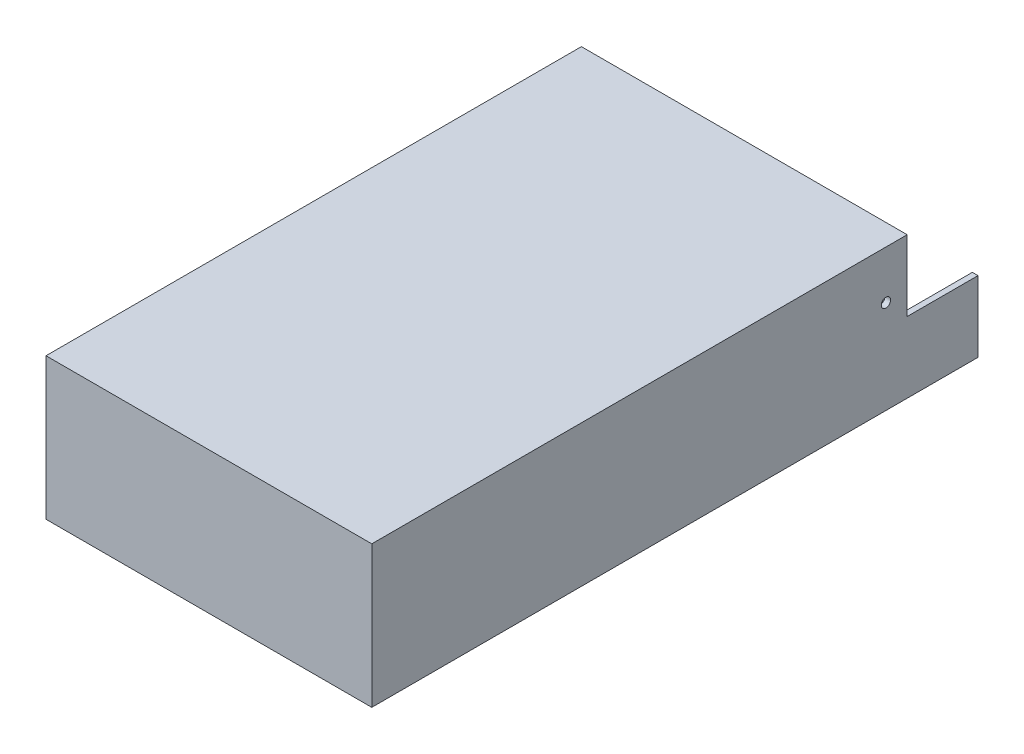
ISO-10303-21;
HEADER;
FILE_DESCRIPTION(('STEP AP214'),'2;1');
FILE_NAME('part.step','',(''),(''),'','','');
FILE_SCHEMA(('AUTOMOTIVE_DESIGN { 1 0 10303 214 1 1 1 1 }'));
ENDSEC;
DATA;
#1=APPLICATION_CONTEXT('core data for automotive mechanical design processes');
#2=APPLICATION_PROTOCOL_DEFINITION('international standard','automotive_design',2000,#1);
#3=PRODUCT_CONTEXT('',#1,'mechanical');
#4=PRODUCT('Part','Part','',(#3));
#5=PRODUCT_RELATED_PRODUCT_CATEGORY('part','',(#4));
#6=PRODUCT_DEFINITION_FORMATION('','',#4);
#7=PRODUCT_DEFINITION_CONTEXT('part definition',#1,'design');
#8=PRODUCT_DEFINITION('design','',#6,#7);
#9=PRODUCT_DEFINITION_SHAPE('','',#8);
#10=(LENGTH_UNIT() NAMED_UNIT(*) SI_UNIT(.MILLI.,.METRE.));
#11=(NAMED_UNIT(*) PLANE_ANGLE_UNIT() SI_UNIT($,.RADIAN.));
#12=(NAMED_UNIT(*) SI_UNIT($,.STERADIAN.) SOLID_ANGLE_UNIT());
#13=UNCERTAINTY_MEASURE_WITH_UNIT(LENGTH_MEASURE(1.E-05),#10,'distance_accuracy_value','');
#14=(GEOMETRIC_REPRESENTATION_CONTEXT(3) GLOBAL_UNCERTAINTY_ASSIGNED_CONTEXT((#13)) GLOBAL_UNIT_ASSIGNED_CONTEXT((#10,
#11,#12)) REPRESENTATION_CONTEXT('',''));
#15=CARTESIAN_POINT('',(0.,0.,0.));
#16=DIRECTION('',(0.,0.,1.));
#17=DIRECTION('',(1.,0.,0.));
#18=AXIS2_PLACEMENT_3D('',#15,#16,#17);
#19=CARTESIAN_POINT('',(0.,25.,-214.));
#20=DIRECTION('',(0.,-1.,0.));
#21=DIRECTION('',(0.,0.,-1.));
#22=AXIS2_PLACEMENT_3D('',#19,#20,#21);
#23=PLANE('',#22);
#24=DIRECTION('',(0.,0.,-1.));
#25=VECTOR('',#24,1.);
#26=CARTESIAN_POINT('',(113.,25.,-214.));
#27=LINE('',#26,#25);
#28=CARTESIAN_POINT('',(113.,25.,-189.));
#29=VERTEX_POINT('',#28);
#30=CARTESIAN_POINT('',(113.,25.,-214.));
#31=VERTEX_POINT('',#30);
#32=EDGE_CURVE('E11',#29,#31,#27,.T.);
#33=ORIENTED_EDGE('',*,*,#32,.F.);
#34=DIRECTION('',(1.,0.,0.));
#35=VECTOR('',#34,1.);
#36=CARTESIAN_POINT('',(0.,25.,-189.));
#37=LINE('',#36,#35);
#38=CARTESIAN_POINT('',(115.,25.,-189.));
#39=VERTEX_POINT('',#38);
#40=EDGE_CURVE('E207',#29,#39,#37,.T.);
#41=ORIENTED_EDGE('',*,*,#40,.T.);
#42=DIRECTION('',(0.,0.,-1.));
#43=VECTOR('',#42,1.);
#44=CARTESIAN_POINT('',(115.,25.,-214.));
#45=LINE('',#44,#43);
#46=CARTESIAN_POINT('',(115.,25.,-214.));
#47=VERTEX_POINT('',#46);
#48=EDGE_CURVE('E189',#39,#47,#45,.T.);
#49=ORIENTED_EDGE('',*,*,#48,.T.);
#50=DIRECTION('',(1.,0.,0.));
#51=VECTOR('',#50,1.);
#52=CARTESIAN_POINT('',(0.,25.,-214.));
#53=LINE('',#52,#51);
#54=EDGE_CURVE('E202',#31,#47,#53,.T.);
#55=ORIENTED_EDGE('',*,*,#54,.F.);
#56=EDGE_LOOP('',(#33,#41,#49,#55));
#57=FACE_BOUND('',#56,.T.);
#58=ADVANCED_FACE('F39',(#57),#23,.F.);
#59=CARTESIAN_POINT('',(0.,50.,0.));
#60=DIRECTION('',(1.,0.,0.));
#61=DIRECTION('',(0.,0.,-1.));
#62=AXIS2_PLACEMENT_3D('',#59,#60,#61);
#63=PLANE('',#62);
#64=CARTESIAN_POINT('',(0.,33.,-181.5));
#65=DIRECTION('',(1.,0.,0.));
#66=DIRECTION('',(0.,0.,-1.));
#67=AXIS2_PLACEMENT_3D('',#64,#65,#66);
#68=CIRCLE('',#67,1.64999999999998);
#69=CARTESIAN_POINT('',(0.,33.,-183.15));
#70=VERTEX_POINT('',#69);
#71=EDGE_CURVE('E311',#70,#70,#68,.T.);
#72=ORIENTED_EDGE('',*,*,#71,.T.);
#73=EDGE_LOOP('',(#72));
#74=FACE_BOUND('',#73,.T.);
#75=DIRECTION('',(0.,-1.,0.));
#76=VECTOR('',#75,1.);
#77=CARTESIAN_POINT('',(0.,50.,-189.));
#78=LINE('',#77,#76);
#79=CARTESIAN_POINT('',(0.,50.,-189.));
#80=VERTEX_POINT('',#79);
#81=CARTESIAN_POINT('',(0.,25.,-189.));
#82=VERTEX_POINT('',#81);
#83=EDGE_CURVE('E65',#80,#82,#78,.T.);
#84=ORIENTED_EDGE('',*,*,#83,.T.);
#85=DIRECTION('',(0.,0.,-1.));
#86=VECTOR('',#85,1.);
#87=CARTESIAN_POINT('',(0.,25.,-214.));
#88=LINE('',#87,#86);
#89=CARTESIAN_POINT('',(0.,25.,-214.));
#90=VERTEX_POINT('',#89);
#91=EDGE_CURVE('E188',#82,#90,#88,.T.);
#92=ORIENTED_EDGE('',*,*,#91,.T.);
#93=DIRECTION('',(0.,-1.,0.));
#94=VECTOR('',#93,1.);
#95=CARTESIAN_POINT('',(0.,50.,-214.));
#96=LINE('',#95,#94);
#97=CARTESIAN_POINT('',(0.,0.,-214.));
#98=VERTEX_POINT('',#97);
#99=EDGE_CURVE('E217',#90,#98,#96,.T.);
#100=ORIENTED_EDGE('',*,*,#99,.T.);
#101=DIRECTION('',(0.,0.,1.));
#102=VECTOR('',#101,1.);
#103=CARTESIAN_POINT('',(0.,0.,0.));
#104=LINE('',#103,#102);
#105=CARTESIAN_POINT('',(0.,0.,0.));
#106=VERTEX_POINT('',#105);
#107=EDGE_CURVE('E201',#98,#106,#104,.T.);
#108=ORIENTED_EDGE('',*,*,#107,.T.);
#109=DIRECTION('',(0.,-1.,0.));
#110=VECTOR('',#109,1.);
#111=CARTESIAN_POINT('',(0.,50.,0.));
#112=LINE('',#111,#110);
#113=CARTESIAN_POINT('',(0.,50.,0.));
#114=VERTEX_POINT('',#113);
#115=EDGE_CURVE('E232',#114,#106,#112,.T.);
#116=ORIENTED_EDGE('',*,*,#115,.F.);
#117=DIRECTION('',(0.,0.,1.));
#118=VECTOR('',#117,1.);
#119=CARTESIAN_POINT('',(0.,50.,0.));
#120=LINE('',#119,#118);
#121=EDGE_CURVE('E209',#80,#114,#120,.T.);
#122=ORIENTED_EDGE('',*,*,#121,.F.);
#123=EDGE_LOOP('',(#84,#92,#100,#108,#116,#122));
#124=FACE_BOUND('',#123,.T.);
#125=ADVANCED_FACE('F41',(#74,#124),#63,.F.);
#126=CARTESIAN_POINT('',(0.,50.,0.));
#127=DIRECTION('',(0.,0.,-1.));
#128=DIRECTION('',(-1.,0.,0.));
#129=AXIS2_PLACEMENT_3D('',#126,#127,#128);
#130=PLANE('',#129);
#131=DIRECTION('',(1.,0.,0.));
#132=VECTOR('',#131,1.);
#133=CARTESIAN_POINT('',(0.,0.,0.));
#134=LINE('',#133,#132);
#135=CARTESIAN_POINT('',(115.,0.,0.));
#136=VERTEX_POINT('',#135);
#137=EDGE_CURVE('E220',#106,#136,#134,.T.);
#138=ORIENTED_EDGE('',*,*,#137,.T.);
#139=DIRECTION('',(0.,-1.,0.));
#140=VECTOR('',#139,1.);
#141=CARTESIAN_POINT('',(115.,50.,0.));
#142=LINE('',#141,#140);
#143=CARTESIAN_POINT('',(115.,50.,0.));
#144=VERTEX_POINT('',#143);
#145=EDGE_CURVE('E230',#144,#136,#142,.T.);
#146=ORIENTED_EDGE('',*,*,#145,.F.);
#147=DIRECTION('',(1.,0.,0.));
#148=VECTOR('',#147,1.);
#149=CARTESIAN_POINT('',(0.,50.,0.));
#150=LINE('',#149,#148);
#151=EDGE_CURVE('E211',#114,#144,#150,.T.);
#152=ORIENTED_EDGE('',*,*,#151,.F.);
#153=ORIENTED_EDGE('',*,*,#115,.T.);
#154=EDGE_LOOP('',(#138,#146,#152,#153));
#155=FACE_BOUND('',#154,.T.);
#156=ADVANCED_FACE('F251',(#155),#130,.F.);
#157=CARTESIAN_POINT('',(115.,50.,0.));
#158=DIRECTION('',(-1.,0.,0.));
#159=DIRECTION('',(0.,0.,1.));
#160=AXIS2_PLACEMENT_3D('',#157,#158,#159);
#161=PLANE('',#160);
#162=CARTESIAN_POINT('',(115.,33.,-181.5));
#163=DIRECTION('',(1.,0.,0.));
#164=DIRECTION('',(0.,0.,-1.));
#165=AXIS2_PLACEMENT_3D('',#162,#163,#164);
#166=CIRCLE('',#165,1.64999999999998);
#167=CARTESIAN_POINT('',(115.,33.,-183.15));
#168=VERTEX_POINT('',#167);
#169=EDGE_CURVE('E314',#168,#168,#166,.T.);
#170=ORIENTED_EDGE('',*,*,#169,.F.);
#171=EDGE_LOOP('',(#170));
#172=FACE_BOUND('',#171,.T.);
#173=DIRECTION('',(0.,-1.,0.));
#174=VECTOR('',#173,1.);
#175=CARTESIAN_POINT('',(115.,50.,-214.));
#176=LINE('',#175,#174);
#177=CARTESIAN_POINT('',(115.,0.,-214.));
#178=VERTEX_POINT('',#177);
#179=EDGE_CURVE('E228',#47,#178,#176,.T.);
#180=ORIENTED_EDGE('',*,*,#179,.F.);
#181=ORIENTED_EDGE('',*,*,#48,.F.);
#182=DIRECTION('',(0.,-1.,0.));
#183=VECTOR('',#182,1.);
#184=CARTESIAN_POINT('',(115.,50.,-189.));
#185=LINE('',#184,#183);
#186=CARTESIAN_POINT('',(115.,50.,-189.));
#187=VERTEX_POINT('',#186);
#188=EDGE_CURVE('E193',#187,#39,#185,.T.);
#189=ORIENTED_EDGE('',*,*,#188,.F.);
#190=DIRECTION('',(0.,0.,-1.));
#191=VECTOR('',#190,1.);
#192=CARTESIAN_POINT('',(115.,50.,0.));
#193=LINE('',#192,#191);
#194=EDGE_CURVE('E214',#144,#187,#193,.T.);
#195=ORIENTED_EDGE('',*,*,#194,.F.);
#196=ORIENTED_EDGE('',*,*,#145,.T.);
#197=DIRECTION('',(0.,0.,-1.));
#198=VECTOR('',#197,1.);
#199=CARTESIAN_POINT('',(115.,0.,0.));
#200=LINE('',#199,#198);
#201=EDGE_CURVE('E222',#136,#178,#200,.T.);
#202=ORIENTED_EDGE('',*,*,#201,.T.);
#203=EDGE_LOOP('',(#180,#181,#189,#195,#196,#202));
#204=FACE_BOUND('',#203,.T.);
#205=ADVANCED_FACE('F257',(#172,#204),#161,.F.);
#206=CARTESIAN_POINT('',(0.,50.,-214.));
#207=DIRECTION('',(0.,0.,1.));
#208=DIRECTION('',(1.,0.,0.));
#209=AXIS2_PLACEMENT_3D('',#206,#207,#208);
#210=PLANE('',#209);
#211=CARTESIAN_POINT('',(2.,25.,-214.));
#212=VERTEX_POINT('',#211);
#213=EDGE_CURVE('E198',#90,#212,#53,.T.);
#214=ORIENTED_EDGE('',*,*,#213,.T.);
#215=DIRECTION('',(0.,-1.,0.));
#216=VECTOR('',#215,1.);
#217=CARTESIAN_POINT('',(2.,50.,-214.));
#218=LINE('',#217,#216);
#219=CARTESIAN_POINT('',(2.,2.,-214.));
#220=VERTEX_POINT('',#219);
#221=EDGE_CURVE('E57',#212,#220,#218,.T.);
#222=ORIENTED_EDGE('',*,*,#221,.T.);
#223=DIRECTION('',(-1.,0.,0.));
#224=VECTOR('',#223,1.);
#225=CARTESIAN_POINT('',(0.,2.,-214.));
#226=LINE('',#225,#224);
#227=CARTESIAN_POINT('',(113.,2.,-214.));
#228=VERTEX_POINT('',#227);
#229=EDGE_CURVE('E160',#228,#220,#226,.T.);
#230=ORIENTED_EDGE('',*,*,#229,.F.);
#231=DIRECTION('',(0.,-1.,0.));
#232=VECTOR('',#231,1.);
#233=CARTESIAN_POINT('',(113.,50.,-214.));
#234=LINE('',#233,#232);
#235=EDGE_CURVE('E175',#31,#228,#234,.T.);
#236=ORIENTED_EDGE('',*,*,#235,.F.);
#237=ORIENTED_EDGE('',*,*,#54,.T.);
#238=ORIENTED_EDGE('',*,*,#179,.T.);
#239=DIRECTION('',(-1.,0.,0.));
#240=VECTOR('',#239,1.);
#241=CARTESIAN_POINT('',(0.,0.,-214.));
#242=LINE('',#241,#240);
#243=EDGE_CURVE('E212',#178,#98,#242,.T.);
#244=ORIENTED_EDGE('',*,*,#243,.T.);
#245=ORIENTED_EDGE('',*,*,#99,.F.);
#246=EDGE_LOOP('',(#214,#222,#230,#236,#237,#238,#244,#245));
#247=FACE_BOUND('',#246,.T.);
#248=ADVANCED_FACE('F242',(#247),#210,.F.);
#249=CARTESIAN_POINT('',(0.,50.,0.));
#250=DIRECTION('',(0.,-1.,0.));
#251=DIRECTION('',(0.,0.,-1.));
#252=AXIS2_PLACEMENT_3D('',#249,#250,#251);
#253=PLANE('',#252);
#254=ORIENTED_EDGE('',*,*,#194,.T.);
#255=DIRECTION('',(1.,0.,0.));
#256=VECTOR('',#255,1.);
#257=CARTESIAN_POINT('',(0.,50.,-189.));
#258=LINE('',#257,#256);
#259=EDGE_CURVE('E192',#80,#187,#258,.T.);
#260=ORIENTED_EDGE('',*,*,#259,.F.);
#261=ORIENTED_EDGE('',*,*,#121,.T.);
#262=ORIENTED_EDGE('',*,*,#151,.T.);
#263=EDGE_LOOP('',(#254,#260,#261,#262));
#264=FACE_BOUND('',#263,.T.);
#265=ADVANCED_FACE('F249',(#264),#253,.F.);
#266=CARTESIAN_POINT('',(0.,0.,0.));
#267=DIRECTION('',(0.,-1.,0.));
#268=DIRECTION('',(0.,0.,-1.));
#269=AXIS2_PLACEMENT_3D('',#266,#267,#268);
#270=PLANE('',#269);
#271=CARTESIAN_POINT('',(57.5,0.,-107.));
#272=DIRECTION('',(0.,-1.,0.));
#273=DIRECTION('',(0.,0.,-1.));
#274=AXIS2_PLACEMENT_3D('',#271,#272,#273);
#275=CIRCLE('',#274,2.14999999999999);
#276=CARTESIAN_POINT('',(57.5,0.,-109.15));
#277=VERTEX_POINT('',#276);
#278=EDGE_CURVE('E302',#277,#277,#275,.T.);
#279=ORIENTED_EDGE('',*,*,#278,.F.);
#280=EDGE_LOOP('',(#279));
#281=FACE_BOUND('',#280,.T.);
#282=CARTESIAN_POINT('',(32.5,0.,-182.));
#283=DIRECTION('',(0.,-1.,0.));
#284=DIRECTION('',(0.,0.,-1.));
#285=AXIS2_PLACEMENT_3D('',#282,#283,#284);
#286=CIRCLE('',#285,2.14999999999999);
#287=CARTESIAN_POINT('',(32.5,0.,-184.15));
#288=VERTEX_POINT('',#287);
#289=EDGE_CURVE('E299',#288,#288,#286,.T.);
#290=ORIENTED_EDGE('',*,*,#289,.F.);
#291=EDGE_LOOP('',(#290));
#292=FACE_BOUND('',#291,.T.);
#293=CARTESIAN_POINT('',(82.5,0.,-32.));
#294=DIRECTION('',(0.,-1.,0.));
#295=DIRECTION('',(0.,0.,-1.));
#296=AXIS2_PLACEMENT_3D('',#293,#294,#295);
#297=CIRCLE('',#296,2.14999999999999);
#298=CARTESIAN_POINT('',(82.5,0.,-34.15));
#299=VERTEX_POINT('',#298);
#300=EDGE_CURVE('E293',#299,#299,#297,.T.);
#301=ORIENTED_EDGE('',*,*,#300,.F.);
#302=EDGE_LOOP('',(#301));
#303=FACE_BOUND('',#302,.T.);
#304=CARTESIAN_POINT('',(82.5,0.,-182.));
#305=DIRECTION('',(0.,-1.,0.));
#306=DIRECTION('',(0.,0.,-1.));
#307=AXIS2_PLACEMENT_3D('',#304,#305,#306);
#308=CIRCLE('',#307,2.14999999999999);
#309=CARTESIAN_POINT('',(82.5,0.,-184.15));
#310=VERTEX_POINT('',#309);
#311=EDGE_CURVE('E287',#310,#310,#308,.T.);
#312=ORIENTED_EDGE('',*,*,#311,.F.);
#313=EDGE_LOOP('',(#312));
#314=FACE_BOUND('',#313,.T.);
#315=CARTESIAN_POINT('',(32.5,0.,-32.));
#316=DIRECTION('',(0.,-1.,0.));
#317=DIRECTION('',(0.,0.,-1.));
#318=AXIS2_PLACEMENT_3D('',#315,#316,#317);
#319=CIRCLE('',#318,2.14999999999999);
#320=CARTESIAN_POINT('',(32.5,0.,-34.15));
#321=VERTEX_POINT('',#320);
#322=EDGE_CURVE('E281',#321,#321,#319,.T.);
#323=ORIENTED_EDGE('',*,*,#322,.F.);
#324=EDGE_LOOP('',(#323));
#325=FACE_BOUND('',#324,.T.);
#326=ORIENTED_EDGE('',*,*,#107,.F.);
#327=ORIENTED_EDGE('',*,*,#243,.F.);
#328=ORIENTED_EDGE('',*,*,#201,.F.);
#329=ORIENTED_EDGE('',*,*,#137,.F.);
#330=EDGE_LOOP('',(#326,#327,#328,#329));
#331=FACE_BOUND('',#330,.T.);
#332=ADVANCED_FACE('F338',(#281,#292,#303,#314,#325,#331),#270,.T.);
#333=CARTESIAN_POINT('',(2.,25.,-189.));
#334=VERTEX_POINT('',#333);
#335=EDGE_CURVE('E203',#82,#334,#37,.T.);
#336=ORIENTED_EDGE('',*,*,#335,.T.);
#337=DIRECTION('',(0.,0.,-1.));
#338=VECTOR('',#337,1.);
#339=CARTESIAN_POINT('',(2.,25.,0.));
#340=LINE('',#339,#338);
#341=EDGE_CURVE('E48',#334,#212,#340,.T.);
#342=ORIENTED_EDGE('',*,*,#341,.T.);
#343=ORIENTED_EDGE('',*,*,#213,.F.);
#344=ORIENTED_EDGE('',*,*,#91,.F.);
#345=EDGE_LOOP('',(#336,#342,#343,#344));
#346=FACE_BOUND('',#345,.T.);
#347=ADVANCED_FACE('F238',(#346),#23,.F.);
#348=CARTESIAN_POINT('',(0.,50.,-189.));
#349=DIRECTION('',(0.,0.,1.));
#350=DIRECTION('',(1.,0.,0.));
#351=AXIS2_PLACEMENT_3D('',#348,#349,#350);
#352=PLANE('',#351);
#353=ORIENTED_EDGE('',*,*,#188,.T.);
#354=ORIENTED_EDGE('',*,*,#40,.F.);
#355=EDGE_CURVE('E206',#334,#29,#37,.T.);
#356=ORIENTED_EDGE('',*,*,#355,.F.);
#357=ORIENTED_EDGE('',*,*,#335,.F.);
#358=ORIENTED_EDGE('',*,*,#83,.F.);
#359=ORIENTED_EDGE('',*,*,#259,.T.);
#360=EDGE_LOOP('',(#353,#354,#356,#357,#358,#359));
#361=FACE_BOUND('',#360,.T.);
#362=ADVANCED_FACE('F260',(#361),#352,.F.);
#363=CARTESIAN_POINT('',(0.,25.,-214.));
#364=DIRECTION('',(0.,-1.,0.));
#365=DIRECTION('',(0.,0.,-1.));
#366=AXIS2_PLACEMENT_3D('',#363,#364,#365);
#367=PLANE('',#366);
#368=ORIENTED_EDGE('',*,*,#355,.T.);
#369=CARTESIAN_POINT('',(113.,25.,-187.));
#370=VERTEX_POINT('',#369);
#371=EDGE_CURVE('E50',#370,#29,#27,.T.);
#372=ORIENTED_EDGE('',*,*,#371,.F.);
#373=DIRECTION('',(1.,0.,0.));
#374=VECTOR('',#373,1.);
#375=CARTESIAN_POINT('',(0.,25.,-187.));
#376=LINE('',#375,#374);
#377=CARTESIAN_POINT('',(2.,25.,-187.));
#378=VERTEX_POINT('',#377);
#379=EDGE_CURVE('E155',#378,#370,#376,.T.);
#380=ORIENTED_EDGE('',*,*,#379,.F.);
#381=EDGE_CURVE('E144',#378,#334,#340,.T.);
#382=ORIENTED_EDGE('',*,*,#381,.T.);
#383=EDGE_LOOP('',(#368,#372,#380,#382));
#384=FACE_BOUND('',#383,.T.);
#385=ADVANCED_FACE('F266',(#384),#367,.T.);
#386=CARTESIAN_POINT('',(2.,50.,0.));
#387=DIRECTION('',(1.,0.,0.));
#388=DIRECTION('',(0.,0.,-1.));
#389=AXIS2_PLACEMENT_3D('',#386,#387,#388);
#390=PLANE('',#389);
#391=CARTESIAN_POINT('',(2.,33.,-181.5));
#392=DIRECTION('',(1.,0.,0.));
#393=DIRECTION('',(0.,0.,-1.));
#394=AXIS2_PLACEMENT_3D('',#391,#392,#393);
#395=CIRCLE('',#394,1.64999999999998);
#396=CARTESIAN_POINT('',(2.,33.,-183.15));
#397=VERTEX_POINT('',#396);
#398=EDGE_CURVE('E305',#397,#397,#395,.T.);
#399=ORIENTED_EDGE('',*,*,#398,.F.);
#400=EDGE_LOOP('',(#399));
#401=FACE_BOUND('',#400,.T.);
#402=DIRECTION('',(0.,-1.,0.));
#403=VECTOR('',#402,1.);
#404=CARTESIAN_POINT('',(2.,50.,-187.));
#405=LINE('',#404,#403);
#406=CARTESIAN_POINT('',(2.,48.,-187.));
#407=VERTEX_POINT('',#406);
#408=EDGE_CURVE('E136',#407,#378,#405,.T.);
#409=ORIENTED_EDGE('',*,*,#408,.F.);
#410=DIRECTION('',(0.,0.,1.));
#411=VECTOR('',#410,1.);
#412=CARTESIAN_POINT('',(2.,48.,0.));
#413=LINE('',#412,#411);
#414=CARTESIAN_POINT('',(2.,48.,-2.));
#415=VERTEX_POINT('',#414);
#416=EDGE_CURVE('E141',#407,#415,#413,.T.);
#417=ORIENTED_EDGE('',*,*,#416,.T.);
#418=DIRECTION('',(0.,-1.,0.));
#419=VECTOR('',#418,1.);
#420=CARTESIAN_POINT('',(2.,50.,-2.));
#421=LINE('',#420,#419);
#422=CARTESIAN_POINT('',(2.,2.,-2.));
#423=VERTEX_POINT('',#422);
#424=EDGE_CURVE('E168',#415,#423,#421,.T.);
#425=ORIENTED_EDGE('',*,*,#424,.T.);
#426=DIRECTION('',(0.,0.,1.));
#427=VECTOR('',#426,1.);
#428=CARTESIAN_POINT('',(2.,2.,0.));
#429=LINE('',#428,#427);
#430=EDGE_CURVE('E172',#220,#423,#429,.T.);
#431=ORIENTED_EDGE('',*,*,#430,.F.);
#432=ORIENTED_EDGE('',*,*,#221,.F.);
#433=ORIENTED_EDGE('',*,*,#341,.F.);
#434=ORIENTED_EDGE('',*,*,#381,.F.);
#435=EDGE_LOOP('',(#409,#417,#425,#431,#432,#433,#434));
#436=FACE_BOUND('',#435,.T.);
#437=ADVANCED_FACE('F138',(#401,#436),#390,.T.);
#438=CARTESIAN_POINT('',(0.,50.,-2.));
#439=DIRECTION('',(0.,0.,-1.));
#440=DIRECTION('',(-1.,0.,0.));
#441=AXIS2_PLACEMENT_3D('',#438,#439,#440);
#442=PLANE('',#441);
#443=DIRECTION('',(1.,0.,0.));
#444=VECTOR('',#443,1.);
#445=CARTESIAN_POINT('',(0.,2.,-2.));
#446=LINE('',#445,#444);
#447=CARTESIAN_POINT('',(113.,2.,-2.));
#448=VERTEX_POINT('',#447);
#449=EDGE_CURVE('E170',#423,#448,#446,.T.);
#450=ORIENTED_EDGE('',*,*,#449,.F.);
#451=ORIENTED_EDGE('',*,*,#424,.F.);
#452=DIRECTION('',(1.,0.,0.));
#453=VECTOR('',#452,1.);
#454=CARTESIAN_POINT('',(0.,48.,-2.));
#455=LINE('',#454,#453);
#456=CARTESIAN_POINT('',(113.,48.,-2.));
#457=VERTEX_POINT('',#456);
#458=EDGE_CURVE('E158',#415,#457,#455,.T.);
#459=ORIENTED_EDGE('',*,*,#458,.T.);
#460=DIRECTION('',(0.,-1.,0.));
#461=VECTOR('',#460,1.);
#462=CARTESIAN_POINT('',(113.,50.,-2.));
#463=LINE('',#462,#461);
#464=EDGE_CURVE('E173',#457,#448,#463,.T.);
#465=ORIENTED_EDGE('',*,*,#464,.T.);
#466=EDGE_LOOP('',(#450,#451,#459,#465));
#467=FACE_BOUND('',#466,.T.);
#468=ADVANCED_FACE('F277',(#467),#442,.T.);
#469=CARTESIAN_POINT('',(113.,50.,0.));
#470=DIRECTION('',(-1.,0.,0.));
#471=DIRECTION('',(0.,0.,1.));
#472=AXIS2_PLACEMENT_3D('',#469,#470,#471);
#473=PLANE('',#472);
#474=CARTESIAN_POINT('',(113.,33.,-181.5));
#475=DIRECTION('',(-1.,0.,0.));
#476=DIRECTION('',(0.,0.,1.));
#477=AXIS2_PLACEMENT_3D('',#474,#475,#476);
#478=CIRCLE('',#477,1.64999999999998);
#479=CARTESIAN_POINT('',(113.,33.,-179.85));
#480=VERTEX_POINT('',#479);
#481=EDGE_CURVE('E308',#480,#480,#478,.T.);
#482=ORIENTED_EDGE('',*,*,#481,.F.);
#483=EDGE_LOOP('',(#482));
#484=FACE_BOUND('',#483,.T.);
#485=ORIENTED_EDGE('',*,*,#235,.T.);
#486=DIRECTION('',(0.,0.,-1.));
#487=VECTOR('',#486,1.);
#488=CARTESIAN_POINT('',(113.,2.,0.));
#489=LINE('',#488,#487);
#490=EDGE_CURVE('E164',#448,#228,#489,.T.);
#491=ORIENTED_EDGE('',*,*,#490,.F.);
#492=ORIENTED_EDGE('',*,*,#464,.F.);
#493=DIRECTION('',(0.,0.,-1.));
#494=VECTOR('',#493,1.);
#495=CARTESIAN_POINT('',(113.,48.,0.));
#496=LINE('',#495,#494);
#497=CARTESIAN_POINT('',(113.,48.,-187.));
#498=VERTEX_POINT('',#497);
#499=EDGE_CURVE('E162',#457,#498,#496,.T.);
#500=ORIENTED_EDGE('',*,*,#499,.T.);
#501=DIRECTION('',(0.,-1.,0.));
#502=VECTOR('',#501,1.);
#503=CARTESIAN_POINT('',(113.,50.,-187.));
#504=LINE('',#503,#502);
#505=EDGE_CURVE('E151',#498,#370,#504,.T.);
#506=ORIENTED_EDGE('',*,*,#505,.T.);
#507=ORIENTED_EDGE('',*,*,#371,.T.);
#508=ORIENTED_EDGE('',*,*,#32,.T.);
#509=EDGE_LOOP('',(#485,#491,#492,#500,#506,#507,#508));
#510=FACE_BOUND('',#509,.T.);
#511=ADVANCED_FACE('F268',(#484,#510),#473,.T.);
#512=CARTESIAN_POINT('',(0.,48.,0.));
#513=DIRECTION('',(0.,-1.,0.));
#514=DIRECTION('',(0.,0.,-1.));
#515=AXIS2_PLACEMENT_3D('',#512,#513,#514);
#516=PLANE('',#515);
#517=ORIENTED_EDGE('',*,*,#499,.F.);
#518=ORIENTED_EDGE('',*,*,#458,.F.);
#519=ORIENTED_EDGE('',*,*,#416,.F.);
#520=DIRECTION('',(1.,0.,0.));
#521=VECTOR('',#520,1.);
#522=CARTESIAN_POINT('',(0.,48.,-187.));
#523=LINE('',#522,#521);
#524=EDGE_CURVE('E148',#407,#498,#523,.T.);
#525=ORIENTED_EDGE('',*,*,#524,.T.);
#526=EDGE_LOOP('',(#517,#518,#519,#525));
#527=FACE_BOUND('',#526,.T.);
#528=ADVANCED_FACE('F157',(#527),#516,.T.);
#529=CARTESIAN_POINT('',(0.,2.,0.));
#530=DIRECTION('',(0.,-1.,0.));
#531=DIRECTION('',(0.,0.,-1.));
#532=AXIS2_PLACEMENT_3D('',#529,#530,#531);
#533=PLANE('',#532);
#534=CARTESIAN_POINT('',(57.5,2.,-107.));
#535=DIRECTION('',(0.,-1.,0.));
#536=DIRECTION('',(0.,0.,-1.));
#537=AXIS2_PLACEMENT_3D('',#534,#535,#536);
#538=CIRCLE('',#537,2.15);
#539=CARTESIAN_POINT('',(57.5,2.,-109.15));
#540=VERTEX_POINT('',#539);
#541=EDGE_CURVE('E43',#540,#540,#538,.T.);
#542=ORIENTED_EDGE('',*,*,#541,.T.);
#543=EDGE_LOOP('',(#542));
#544=FACE_BOUND('',#543,.T.);
#545=CARTESIAN_POINT('',(32.5,2.,-182.));
#546=DIRECTION('',(0.,-1.,0.));
#547=DIRECTION('',(0.,0.,-1.));
#548=AXIS2_PLACEMENT_3D('',#545,#546,#547);
#549=CIRCLE('',#548,2.15);
#550=CARTESIAN_POINT('',(32.5,2.,-184.15));
#551=VERTEX_POINT('',#550);
#552=EDGE_CURVE('E296',#551,#551,#549,.T.);
#553=ORIENTED_EDGE('',*,*,#552,.T.);
#554=EDGE_LOOP('',(#553));
#555=FACE_BOUND('',#554,.T.);
#556=CARTESIAN_POINT('',(82.5,2.,-32.));
#557=DIRECTION('',(0.,-1.,0.));
#558=DIRECTION('',(0.,0.,-1.));
#559=AXIS2_PLACEMENT_3D('',#556,#557,#558);
#560=CIRCLE('',#559,2.14999999999999);
#561=CARTESIAN_POINT('',(82.5,2.,-34.15));
#562=VERTEX_POINT('',#561);
#563=EDGE_CURVE('E290',#562,#562,#560,.T.);
#564=ORIENTED_EDGE('',*,*,#563,.T.);
#565=EDGE_LOOP('',(#564));
#566=FACE_BOUND('',#565,.T.);
#567=CARTESIAN_POINT('',(82.5,2.,-182.));
#568=DIRECTION('',(0.,-1.,0.));
#569=DIRECTION('',(0.,0.,-1.));
#570=AXIS2_PLACEMENT_3D('',#567,#568,#569);
#571=CIRCLE('',#570,2.14999999999999);
#572=CARTESIAN_POINT('',(82.5,2.,-184.15));
#573=VERTEX_POINT('',#572);
#574=EDGE_CURVE('E284',#573,#573,#571,.T.);
#575=ORIENTED_EDGE('',*,*,#574,.T.);
#576=EDGE_LOOP('',(#575));
#577=FACE_BOUND('',#576,.T.);
#578=CARTESIAN_POINT('',(32.5,2.,-32.));
#579=DIRECTION('',(0.,-1.,0.));
#580=DIRECTION('',(0.,0.,-1.));
#581=AXIS2_PLACEMENT_3D('',#578,#579,#580);
#582=CIRCLE('',#581,2.15);
#583=CARTESIAN_POINT('',(32.5,2.,-34.15));
#584=VERTEX_POINT('',#583);
#585=EDGE_CURVE('E178',#584,#584,#582,.T.);
#586=ORIENTED_EDGE('',*,*,#585,.T.);
#587=EDGE_LOOP('',(#586));
#588=FACE_BOUND('',#587,.T.);
#589=ORIENTED_EDGE('',*,*,#430,.T.);
#590=ORIENTED_EDGE('',*,*,#449,.T.);
#591=ORIENTED_EDGE('',*,*,#490,.T.);
#592=ORIENTED_EDGE('',*,*,#229,.T.);
#593=EDGE_LOOP('',(#589,#590,#591,#592));
#594=FACE_BOUND('',#593,.T.);
#595=ADVANCED_FACE('F275',(#544,#555,#566,#577,#588,#594),#533,.F.);
#596=CARTESIAN_POINT('',(0.,50.,-187.));
#597=DIRECTION('',(0.,0.,1.));
#598=DIRECTION('',(1.,0.,0.));
#599=AXIS2_PLACEMENT_3D('',#596,#597,#598);
#600=PLANE('',#599);
#601=ORIENTED_EDGE('',*,*,#505,.F.);
#602=ORIENTED_EDGE('',*,*,#524,.F.);
#603=ORIENTED_EDGE('',*,*,#408,.T.);
#604=ORIENTED_EDGE('',*,*,#379,.T.);
#605=EDGE_LOOP('',(#601,#602,#603,#604));
#606=FACE_BOUND('',#605,.T.);
#607=ADVANCED_FACE('F149',(#606),#600,.T.);
#608=CARTESIAN_POINT('',(32.5,0.,-32.));
#609=DIRECTION('',(0.,-1.,0.));
#610=DIRECTION('',(0.,0.,-1.));
#611=AXIS2_PLACEMENT_3D('',#608,#609,#610);
#612=CYLINDRICAL_SURFACE('',#611,2.15);
#613=ORIENTED_EDGE('',*,*,#322,.T.);
#614=EDGE_LOOP('',(#613));
#615=FACE_BOUND('',#614,.T.);
#616=ORIENTED_EDGE('',*,*,#585,.F.);
#617=EDGE_LOOP('',(#616));
#618=FACE_BOUND('',#617,.T.);
#619=ADVANCED_FACE('F361',(#615,#618),#612,.F.);
#620=CARTESIAN_POINT('',(82.5,0.,-182.));
#621=DIRECTION('',(0.,-1.,0.));
#622=DIRECTION('',(0.,0.,-1.));
#623=AXIS2_PLACEMENT_3D('',#620,#621,#622);
#624=CYLINDRICAL_SURFACE('',#623,2.14999999999999);
#625=ORIENTED_EDGE('',*,*,#311,.T.);
#626=EDGE_LOOP('',(#625));
#627=FACE_BOUND('',#626,.T.);
#628=ORIENTED_EDGE('',*,*,#574,.F.);
#629=EDGE_LOOP('',(#628));
#630=FACE_BOUND('',#629,.T.);
#631=ADVANCED_FACE('F364',(#627,#630),#624,.F.);
#632=CARTESIAN_POINT('',(82.5,0.,-32.));
#633=DIRECTION('',(0.,-1.,0.));
#634=DIRECTION('',(0.,0.,-1.));
#635=AXIS2_PLACEMENT_3D('',#632,#633,#634);
#636=CYLINDRICAL_SURFACE('',#635,2.14999999999999);
#637=ORIENTED_EDGE('',*,*,#300,.T.);
#638=EDGE_LOOP('',(#637));
#639=FACE_BOUND('',#638,.T.);
#640=ORIENTED_EDGE('',*,*,#563,.F.);
#641=EDGE_LOOP('',(#640));
#642=FACE_BOUND('',#641,.T.);
#643=ADVANCED_FACE('F388',(#639,#642),#636,.F.);
#644=CARTESIAN_POINT('',(32.5,0.,-182.));
#645=DIRECTION('',(0.,-1.,0.));
#646=DIRECTION('',(0.,0.,-1.));
#647=AXIS2_PLACEMENT_3D('',#644,#645,#646);
#648=CYLINDRICAL_SURFACE('',#647,2.15);
#649=ORIENTED_EDGE('',*,*,#289,.T.);
#650=EDGE_LOOP('',(#649));
#651=FACE_BOUND('',#650,.T.);
#652=ORIENTED_EDGE('',*,*,#552,.F.);
#653=EDGE_LOOP('',(#652));
#654=FACE_BOUND('',#653,.T.);
#655=ADVANCED_FACE('F392',(#651,#654),#648,.F.);
#656=CARTESIAN_POINT('',(57.5,0.,-107.));
#657=DIRECTION('',(0.,-1.,0.));
#658=DIRECTION('',(0.,0.,-1.));
#659=AXIS2_PLACEMENT_3D('',#656,#657,#658);
#660=CYLINDRICAL_SURFACE('',#659,2.15);
#661=ORIENTED_EDGE('',*,*,#278,.T.);
#662=EDGE_LOOP('',(#661));
#663=FACE_BOUND('',#662,.T.);
#664=ORIENTED_EDGE('',*,*,#541,.F.);
#665=EDGE_LOOP('',(#664));
#666=FACE_BOUND('',#665,.T.);
#667=ADVANCED_FACE('F396',(#663,#666),#660,.F.);
#668=CARTESIAN_POINT('',(115.,33.,-181.5));
#669=DIRECTION('',(1.,0.,0.));
#670=DIRECTION('',(0.,0.,-1.));
#671=AXIS2_PLACEMENT_3D('',#668,#669,#670);
#672=CYLINDRICAL_SURFACE('',#671,1.64999999999998);
#673=ORIENTED_EDGE('',*,*,#481,.T.);
#674=EDGE_LOOP('',(#673));
#675=FACE_BOUND('',#674,.T.);
#676=ORIENTED_EDGE('',*,*,#169,.T.);
#677=EDGE_LOOP('',(#676));
#678=FACE_BOUND('',#677,.T.);
#679=ADVANCED_FACE('F318',(#675,#678),#672,.F.);
#680=ORIENTED_EDGE('',*,*,#398,.T.);
#681=EDGE_LOOP('',(#680));
#682=FACE_BOUND('',#681,.T.);
#683=ORIENTED_EDGE('',*,*,#71,.F.);
#684=EDGE_LOOP('',(#683));
#685=FACE_BOUND('',#684,.T.);
#686=ADVANCED_FACE('F402',(#682,#685),#672,.F.);
#687=CLOSED_SHELL('',(#58,#125,#156,#205,#248,#265,#332,#347,#362,#385,#437,#468,#511,#528,#595,
#607,#619,#631,#643,#655,#667,#679,#686));
#688=MANIFOLD_SOLID_BREP('B2',#687);
#689=ADVANCED_BREP_SHAPE_REPRESENTATION('',(#18,#688),#14);
#690=SHAPE_DEFINITION_REPRESENTATION(#9,#689);
ENDSEC;
END-ISO-10303-21;
